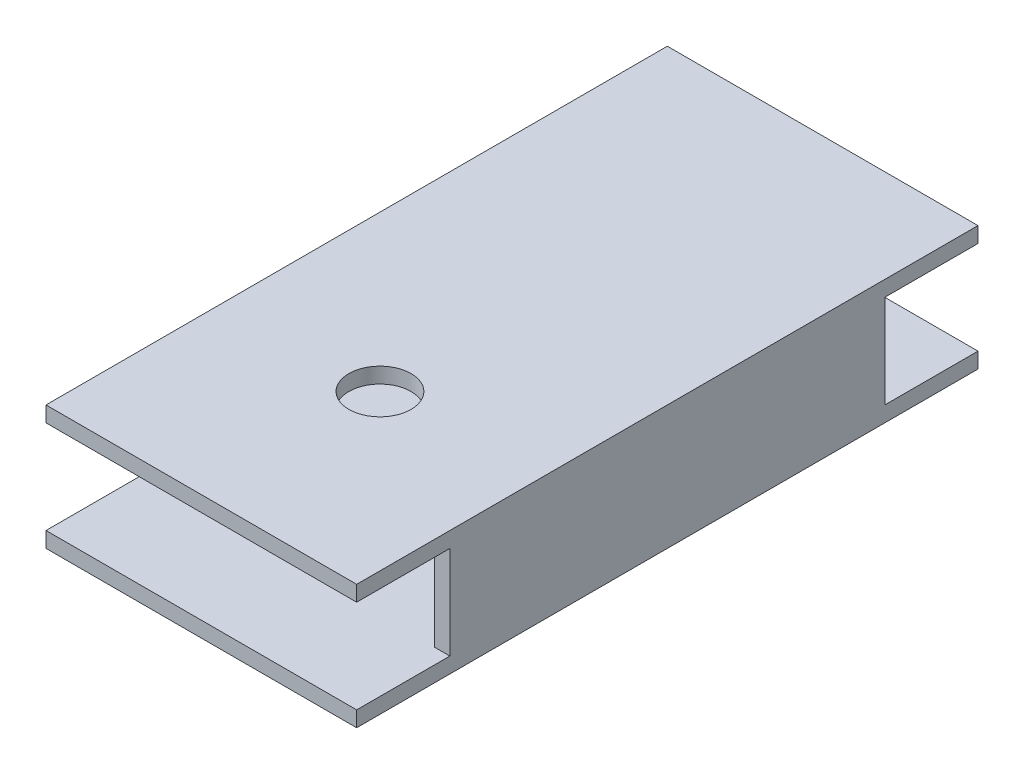
ISO-10303-21;
HEADER;
FILE_DESCRIPTION(('STEP AP214'),'2;1');
FILE_NAME('part.step','',(''),(''),'','','');
FILE_SCHEMA(('AUTOMOTIVE_DESIGN { 1 0 10303 214 1 1 1 1 }'));
ENDSEC;
DATA;
#1=APPLICATION_CONTEXT('core data for automotive mechanical design processes');
#2=APPLICATION_PROTOCOL_DEFINITION('international standard','automotive_design',2000,#1);
#3=PRODUCT_CONTEXT('',#1,'mechanical');
#4=PRODUCT('Part','Part','',(#3));
#5=PRODUCT_RELATED_PRODUCT_CATEGORY('part','',(#4));
#6=PRODUCT_DEFINITION_FORMATION('','',#4);
#7=PRODUCT_DEFINITION_CONTEXT('part definition',#1,'design');
#8=PRODUCT_DEFINITION('design','',#6,#7);
#9=PRODUCT_DEFINITION_SHAPE('','',#8);
#10=(LENGTH_UNIT() NAMED_UNIT(*) SI_UNIT(.MILLI.,.METRE.));
#11=(NAMED_UNIT(*) PLANE_ANGLE_UNIT() SI_UNIT($,.RADIAN.));
#12=(NAMED_UNIT(*) SI_UNIT($,.STERADIAN.) SOLID_ANGLE_UNIT());
#13=UNCERTAINTY_MEASURE_WITH_UNIT(LENGTH_MEASURE(1.E-05),#10,'distance_accuracy_value','');
#14=(GEOMETRIC_REPRESENTATION_CONTEXT(3) GLOBAL_UNCERTAINTY_ASSIGNED_CONTEXT((#13)) GLOBAL_UNIT_ASSIGNED_CONTEXT((#10,
#11,#12)) REPRESENTATION_CONTEXT('',''));
#15=CARTESIAN_POINT('',(0.,0.,0.));
#16=DIRECTION('',(0.,0.,1.));
#17=DIRECTION('',(1.,0.,0.));
#18=AXIS2_PLACEMENT_3D('',#15,#16,#17);
#19=CARTESIAN_POINT('',(0.,0.,127.));
#20=DIRECTION('',(0.,0.,1.));
#21=DIRECTION('',(1.,0.,0.));
#22=AXIS2_PLACEMENT_3D('',#19,#20,#21);
#23=PLANE('',#22);
#24=DIRECTION('',(-1.,0.,0.));
#25=VECTOR('',#24,1.);
#26=CARTESIAN_POINT('',(0.,22.225,127.));
#27=LINE('',#26,#25);
#28=CARTESIAN_POINT('',(63.5,22.225,127.));
#29=VERTEX_POINT('',#28);
#30=CARTESIAN_POINT('',(0.,22.225,127.));
#31=VERTEX_POINT('',#30);
#32=EDGE_CURVE('E181',#29,#31,#27,.T.);
#33=ORIENTED_EDGE('',*,*,#32,.F.);
#34=DIRECTION('',(0.,1.,0.));
#35=VECTOR('',#34,1.);
#36=CARTESIAN_POINT('',(63.5,0.,127.));
#37=LINE('',#36,#35);
#38=CARTESIAN_POINT('',(63.5,25.4,127.));
#39=VERTEX_POINT('',#38);
#40=EDGE_CURVE('E208',#29,#39,#37,.T.);
#41=ORIENTED_EDGE('',*,*,#40,.T.);
#42=DIRECTION('',(-1.,0.,0.));
#43=VECTOR('',#42,1.);
#44=CARTESIAN_POINT('',(0.,25.4,127.));
#45=LINE('',#44,#43);
#46=CARTESIAN_POINT('',(0.,25.4,127.));
#47=VERTEX_POINT('',#46);
#48=EDGE_CURVE('E210',#39,#47,#45,.T.);
#49=ORIENTED_EDGE('',*,*,#48,.T.);
#50=DIRECTION('',(0.,-1.,0.));
#51=VECTOR('',#50,1.);
#52=CARTESIAN_POINT('',(0.,0.,127.));
#53=LINE('',#52,#51);
#54=EDGE_CURVE('E196',#47,#31,#53,.T.);
#55=ORIENTED_EDGE('',*,*,#54,.T.);
#56=EDGE_LOOP('',(#33,#41,#49,#55));
#57=FACE_BOUND('',#56,.T.);
#58=ADVANCED_FACE('F57',(#57),#23,.T.);
#59=CARTESIAN_POINT('',(0.,0.,0.));
#60=DIRECTION('',(0.,0.,1.));
#61=DIRECTION('',(1.,0.,0.));
#62=AXIS2_PLACEMENT_3D('',#59,#60,#61);
#63=PLANE('',#62);
#64=DIRECTION('',(0.,-1.,0.));
#65=VECTOR('',#64,1.);
#66=CARTESIAN_POINT('',(0.,0.,0.));
#67=LINE('',#66,#65);
#68=CARTESIAN_POINT('',(0.,3.175,0.));
#69=VERTEX_POINT('',#68);
#70=CARTESIAN_POINT('',(0.,0.,0.));
#71=VERTEX_POINT('',#70);
#72=EDGE_CURVE('E217',#69,#71,#67,.T.);
#73=ORIENTED_EDGE('',*,*,#72,.F.);
#74=DIRECTION('',(1.,0.,0.));
#75=VECTOR('',#74,1.);
#76=CARTESIAN_POINT('',(0.,3.175,0.));
#77=LINE('',#76,#75);
#78=CARTESIAN_POINT('',(63.5,3.175,0.));
#79=VERTEX_POINT('',#78);
#80=EDGE_CURVE('E239',#69,#79,#77,.T.);
#81=ORIENTED_EDGE('',*,*,#80,.T.);
#82=DIRECTION('',(0.,1.,0.));
#83=VECTOR('',#82,1.);
#84=CARTESIAN_POINT('',(63.5,0.,0.));
#85=LINE('',#84,#83);
#86=CARTESIAN_POINT('',(63.5,0.,0.));
#87=VERTEX_POINT('',#86);
#88=EDGE_CURVE('E201',#87,#79,#85,.T.);
#89=ORIENTED_EDGE('',*,*,#88,.F.);
#90=DIRECTION('',(1.,0.,0.));
#91=VECTOR('',#90,1.);
#92=CARTESIAN_POINT('',(0.,0.,0.));
#93=LINE('',#92,#91);
#94=EDGE_CURVE('E216',#71,#87,#93,.T.);
#95=ORIENTED_EDGE('',*,*,#94,.F.);
#96=EDGE_LOOP('',(#73,#81,#89,#95));
#97=FACE_BOUND('',#96,.T.);
#98=ADVANCED_FACE('F238',(#97),#63,.F.);
#99=DIRECTION('',(1.,0.,0.));
#100=VECTOR('',#99,1.);
#101=CARTESIAN_POINT('',(0.,3.175,127.));
#102=LINE('',#101,#100);
#103=CARTESIAN_POINT('',(0.,3.175,127.));
#104=VERTEX_POINT('',#103);
#105=CARTESIAN_POINT('',(63.5,3.175,127.));
#106=VERTEX_POINT('',#105);
#107=EDGE_CURVE('E172',#104,#106,#102,.T.);
#108=ORIENTED_EDGE('',*,*,#107,.F.);
#109=CARTESIAN_POINT('',(0.,0.,127.));
#110=VERTEX_POINT('',#109);
#111=EDGE_CURVE('E176',#104,#110,#53,.T.);
#112=ORIENTED_EDGE('',*,*,#111,.T.);
#113=DIRECTION('',(1.,0.,0.));
#114=VECTOR('',#113,1.);
#115=CARTESIAN_POINT('',(0.,0.,127.));
#116=LINE('',#115,#114);
#117=CARTESIAN_POINT('',(63.5,0.,127.));
#118=VERTEX_POINT('',#117);
#119=EDGE_CURVE('E200',#110,#118,#116,.T.);
#120=ORIENTED_EDGE('',*,*,#119,.T.);
#121=EDGE_CURVE('E179',#118,#106,#37,.T.);
#122=ORIENTED_EDGE('',*,*,#121,.T.);
#123=EDGE_LOOP('',(#108,#112,#120,#122));
#124=FACE_BOUND('',#123,.T.);
#125=ADVANCED_FACE('F174',(#124),#23,.T.);
#126=CARTESIAN_POINT('',(63.5,22.225,0.));
#127=VERTEX_POINT('',#126);
#128=CARTESIAN_POINT('',(63.5,25.4,0.));
#129=VERTEX_POINT('',#128);
#130=EDGE_CURVE('E219',#127,#129,#85,.T.);
#131=ORIENTED_EDGE('',*,*,#130,.F.);
#132=DIRECTION('',(-1.,0.,0.));
#133=VECTOR('',#132,1.);
#134=CARTESIAN_POINT('',(0.,22.225,0.));
#135=LINE('',#134,#133);
#136=CARTESIAN_POINT('',(0.,22.225,0.));
#137=VERTEX_POINT('',#136);
#138=EDGE_CURVE('E182',#127,#137,#135,.T.);
#139=ORIENTED_EDGE('',*,*,#138,.T.);
#140=CARTESIAN_POINT('',(0.,25.4,0.));
#141=VERTEX_POINT('',#140);
#142=EDGE_CURVE('E213',#141,#137,#67,.T.);
#143=ORIENTED_EDGE('',*,*,#142,.F.);
#144=DIRECTION('',(-1.,0.,0.));
#145=VECTOR('',#144,1.);
#146=CARTESIAN_POINT('',(0.,25.4,0.));
#147=LINE('',#146,#145);
#148=EDGE_CURVE('E197',#129,#141,#147,.T.);
#149=ORIENTED_EDGE('',*,*,#148,.F.);
#150=EDGE_LOOP('',(#131,#139,#143,#149));
#151=FACE_BOUND('',#150,.T.);
#152=ADVANCED_FACE('F349',(#151),#63,.F.);
#153=CARTESIAN_POINT('',(0.,0.,127.));
#154=DIRECTION('',(1.,0.,0.));
#155=DIRECTION('',(0.,0.,-1.));
#156=AXIS2_PLACEMENT_3D('',#153,#154,#155);
#157=PLANE('',#156);
#158=DIRECTION('',(0.,1.,0.));
#159=VECTOR('',#158,1.);
#160=CARTESIAN_POINT('',(0.,22.225,107.95));
#161=LINE('',#160,#159);
#162=CARTESIAN_POINT('',(0.,3.175,107.95));
#163=VERTEX_POINT('',#162);
#164=CARTESIAN_POINT('',(0.,22.225,107.95));
#165=VERTEX_POINT('',#164);
#166=EDGE_CURVE('E192',#163,#165,#161,.T.);
#167=ORIENTED_EDGE('',*,*,#166,.T.);
#168=DIRECTION('',(0.,0.,1.));
#169=VECTOR('',#168,1.);
#170=CARTESIAN_POINT('',(0.,22.225,127.));
#171=LINE('',#170,#169);
#172=EDGE_CURVE('E308',#165,#31,#171,.T.);
#173=ORIENTED_EDGE('',*,*,#172,.T.);
#174=ORIENTED_EDGE('',*,*,#54,.F.);
#175=DIRECTION('',(0.,0.,-1.));
#176=VECTOR('',#175,1.);
#177=CARTESIAN_POINT('',(0.,25.4,127.));
#178=LINE('',#177,#176);
#179=EDGE_CURVE('E212',#47,#141,#178,.T.);
#180=ORIENTED_EDGE('',*,*,#179,.T.);
#181=ORIENTED_EDGE('',*,*,#142,.T.);
#182=DIRECTION('',(0.,0.,1.));
#183=VECTOR('',#182,1.);
#184=CARTESIAN_POINT('',(0.,22.225,0.));
#185=LINE('',#184,#183);
#186=CARTESIAN_POINT('',(0.,22.225,19.05));
#187=VERTEX_POINT('',#186);
#188=EDGE_CURVE('E250',#137,#187,#185,.T.);
#189=ORIENTED_EDGE('',*,*,#188,.T.);
#190=DIRECTION('',(0.,-1.,0.));
#191=VECTOR('',#190,1.);
#192=CARTESIAN_POINT('',(0.,22.225,19.05));
#193=LINE('',#192,#191);
#194=CARTESIAN_POINT('',(0.,3.175,19.05));
#195=VERTEX_POINT('',#194);
#196=EDGE_CURVE('E254',#187,#195,#193,.T.);
#197=ORIENTED_EDGE('',*,*,#196,.T.);
#198=DIRECTION('',(0.,0.,-1.));
#199=VECTOR('',#198,1.);
#200=CARTESIAN_POINT('',(0.,3.175,0.));
#201=LINE('',#200,#199);
#202=EDGE_CURVE('E282',#195,#69,#201,.T.);
#203=ORIENTED_EDGE('',*,*,#202,.T.);
#204=ORIENTED_EDGE('',*,*,#72,.T.);
#205=DIRECTION('',(0.,0.,-1.));
#206=VECTOR('',#205,1.);
#207=CARTESIAN_POINT('',(0.,0.,127.));
#208=LINE('',#207,#206);
#209=EDGE_CURVE('E12',#110,#71,#208,.T.);
#210=ORIENTED_EDGE('',*,*,#209,.F.);
#211=ORIENTED_EDGE('',*,*,#111,.F.);
#212=DIRECTION('',(0.,0.,-1.));
#213=VECTOR('',#212,1.);
#214=CARTESIAN_POINT('',(0.,3.175,127.));
#215=LINE('',#214,#213);
#216=EDGE_CURVE('E185',#104,#163,#215,.T.);
#217=ORIENTED_EDGE('',*,*,#216,.T.);
#218=EDGE_LOOP('',(#167,#173,#174,#180,#181,#189,#197,#203,#204,#210,#211,#217));
#219=FACE_BOUND('',#218,.T.);
#220=ADVANCED_FACE('F59',(#219),#157,.F.);
#221=CARTESIAN_POINT('',(0.,0.,127.));
#222=DIRECTION('',(0.,1.,0.));
#223=DIRECTION('',(0.,0.,1.));
#224=AXIS2_PLACEMENT_3D('',#221,#222,#223);
#225=PLANE('',#224);
#226=CARTESIAN_POINT('',(31.75,0.,90.4875));
#227=DIRECTION('',(0.,1.,0.));
#228=DIRECTION('',(0.,0.,1.));
#229=AXIS2_PLACEMENT_3D('',#226,#227,#228);
#230=CIRCLE('',#229,6.35);
#231=CARTESIAN_POINT('',(31.75,0.,96.8375));
#232=VERTEX_POINT('',#231);
#233=EDGE_CURVE('E317',#232,#232,#230,.T.);
#234=ORIENTED_EDGE('',*,*,#233,.T.);
#235=EDGE_LOOP('',(#234));
#236=FACE_BOUND('',#235,.T.);
#237=ORIENTED_EDGE('',*,*,#94,.T.);
#238=DIRECTION('',(0.,0.,-1.));
#239=VECTOR('',#238,1.);
#240=CARTESIAN_POINT('',(63.5,0.,127.));
#241=LINE('',#240,#239);
#242=EDGE_CURVE('E66',#118,#87,#241,.T.);
#243=ORIENTED_EDGE('',*,*,#242,.F.);
#244=ORIENTED_EDGE('',*,*,#119,.F.);
#245=ORIENTED_EDGE('',*,*,#209,.T.);
#246=EDGE_LOOP('',(#237,#243,#244,#245));
#247=FACE_BOUND('',#246,.T.);
#248=ADVANCED_FACE('F380',(#236,#247),#225,.F.);
#249=CARTESIAN_POINT('',(63.5,0.,127.));
#250=DIRECTION('',(-1.,0.,0.));
#251=DIRECTION('',(0.,0.,1.));
#252=AXIS2_PLACEMENT_3D('',#249,#250,#251);
#253=PLANE('',#252);
#254=ORIENTED_EDGE('',*,*,#40,.F.);
#255=DIRECTION('',(0.,0.,1.));
#256=VECTOR('',#255,1.);
#257=CARTESIAN_POINT('',(63.5,22.225,127.));
#258=LINE('',#257,#256);
#259=CARTESIAN_POINT('',(63.5,22.225,107.95));
#260=VERTEX_POINT('',#259);
#261=EDGE_CURVE('E193',#260,#29,#258,.T.);
#262=ORIENTED_EDGE('',*,*,#261,.F.);
#263=DIRECTION('',(0.,1.,0.));
#264=VECTOR('',#263,1.);
#265=CARTESIAN_POINT('',(63.5,22.225,107.95));
#266=LINE('',#265,#264);
#267=CARTESIAN_POINT('',(63.5,3.175,107.95));
#268=VERTEX_POINT('',#267);
#269=EDGE_CURVE('E302',#268,#260,#266,.T.);
#270=ORIENTED_EDGE('',*,*,#269,.F.);
#271=DIRECTION('',(0.,0.,-1.));
#272=VECTOR('',#271,1.);
#273=CARTESIAN_POINT('',(63.5,3.175,127.));
#274=LINE('',#273,#272);
#275=EDGE_CURVE('E305',#106,#268,#274,.T.);
#276=ORIENTED_EDGE('',*,*,#275,.F.);
#277=ORIENTED_EDGE('',*,*,#121,.F.);
#278=ORIENTED_EDGE('',*,*,#242,.T.);
#279=ORIENTED_EDGE('',*,*,#88,.T.);
#280=DIRECTION('',(0.,0.,-1.));
#281=VECTOR('',#280,1.);
#282=CARTESIAN_POINT('',(63.5,3.175,0.));
#283=LINE('',#282,#281);
#284=CARTESIAN_POINT('',(63.5,3.175,19.05));
#285=VERTEX_POINT('',#284);
#286=EDGE_CURVE('E245',#285,#79,#283,.T.);
#287=ORIENTED_EDGE('',*,*,#286,.F.);
#288=DIRECTION('',(0.,-1.,0.));
#289=VECTOR('',#288,1.);
#290=CARTESIAN_POINT('',(63.5,22.225,19.05));
#291=LINE('',#290,#289);
#292=CARTESIAN_POINT('',(63.5,22.225,19.05));
#293=VERTEX_POINT('',#292);
#294=EDGE_CURVE('E251',#293,#285,#291,.T.);
#295=ORIENTED_EDGE('',*,*,#294,.F.);
#296=DIRECTION('',(0.,0.,1.));
#297=VECTOR('',#296,1.);
#298=CARTESIAN_POINT('',(63.5,22.225,0.));
#299=LINE('',#298,#297);
#300=EDGE_CURVE('E256',#127,#293,#299,.T.);
#301=ORIENTED_EDGE('',*,*,#300,.F.);
#302=ORIENTED_EDGE('',*,*,#130,.T.);
#303=DIRECTION('',(0.,0.,-1.));
#304=VECTOR('',#303,1.);
#305=CARTESIAN_POINT('',(63.5,25.4,127.));
#306=LINE('',#305,#304);
#307=EDGE_CURVE('E224',#39,#129,#306,.T.);
#308=ORIENTED_EDGE('',*,*,#307,.F.);
#309=EDGE_LOOP('',(#254,#262,#270,#276,#277,#278,#279,#287,#295,#301,#302,#308));
#310=FACE_BOUND('',#309,.T.);
#311=ADVANCED_FACE('F232',(#310),#253,.F.);
#312=CARTESIAN_POINT('',(0.,25.4,127.));
#313=DIRECTION('',(0.,-1.,0.));
#314=DIRECTION('',(0.,0.,-1.));
#315=AXIS2_PLACEMENT_3D('',#312,#313,#314);
#316=PLANE('',#315);
#317=CARTESIAN_POINT('',(31.75,25.4,90.4875));
#318=DIRECTION('',(0.,1.,0.));
#319=DIRECTION('',(0.,0.,1.));
#320=AXIS2_PLACEMENT_3D('',#317,#318,#319);
#321=CIRCLE('',#320,6.35);
#322=CARTESIAN_POINT('',(31.75,25.4,96.8375));
#323=VERTEX_POINT('',#322);
#324=EDGE_CURVE('E314',#323,#323,#321,.T.);
#325=ORIENTED_EDGE('',*,*,#324,.F.);
#326=EDGE_LOOP('',(#325));
#327=FACE_BOUND('',#326,.T.);
#328=ORIENTED_EDGE('',*,*,#148,.T.);
#329=ORIENTED_EDGE('',*,*,#179,.F.);
#330=ORIENTED_EDGE('',*,*,#48,.F.);
#331=ORIENTED_EDGE('',*,*,#307,.T.);
#332=EDGE_LOOP('',(#328,#329,#330,#331));
#333=FACE_BOUND('',#332,.T.);
#334=ADVANCED_FACE('F344',(#327,#333),#316,.F.);
#335=CARTESIAN_POINT('',(3.175,0.,127.));
#336=DIRECTION('',(1.,0.,0.));
#337=DIRECTION('',(0.,0.,-1.));
#338=AXIS2_PLACEMENT_3D('',#335,#336,#337);
#339=PLANE('',#338);
#340=DIRECTION('',(0.,1.,0.));
#341=VECTOR('',#340,1.);
#342=CARTESIAN_POINT('',(3.175,0.,107.95));
#343=LINE('',#342,#341);
#344=CARTESIAN_POINT('',(3.175,3.175,107.95));
#345=VERTEX_POINT('',#344);
#346=CARTESIAN_POINT('',(3.175,22.225,107.95));
#347=VERTEX_POINT('',#346);
#348=EDGE_CURVE('E287',#345,#347,#343,.T.);
#349=ORIENTED_EDGE('',*,*,#348,.F.);
#350=DIRECTION('',(0.,0.,-1.));
#351=VECTOR('',#350,1.);
#352=CARTESIAN_POINT('',(3.175,3.175,127.));
#353=LINE('',#352,#351);
#354=CARTESIAN_POINT('',(3.175,3.175,19.05));
#355=VERTEX_POINT('',#354);
#356=EDGE_CURVE('E205',#345,#355,#353,.T.);
#357=ORIENTED_EDGE('',*,*,#356,.T.);
#358=DIRECTION('',(0.,-1.,0.));
#359=VECTOR('',#358,1.);
#360=CARTESIAN_POINT('',(3.175,0.,19.05));
#361=LINE('',#360,#359);
#362=CARTESIAN_POINT('',(3.175,22.225,19.05));
#363=VERTEX_POINT('',#362);
#364=EDGE_CURVE('E243',#363,#355,#361,.T.);
#365=ORIENTED_EDGE('',*,*,#364,.F.);
#366=DIRECTION('',(0.,0.,-1.));
#367=VECTOR('',#366,1.);
#368=CARTESIAN_POINT('',(3.175,22.225,127.));
#369=LINE('',#368,#367);
#370=EDGE_CURVE('E272',#347,#363,#369,.T.);
#371=ORIENTED_EDGE('',*,*,#370,.F.);
#372=EDGE_LOOP('',(#349,#357,#365,#371));
#373=FACE_BOUND('',#372,.T.);
#374=ADVANCED_FACE('F354',(#373),#339,.T.);
#375=CARTESIAN_POINT('',(0.,3.175,127.));
#376=DIRECTION('',(0.,1.,0.));
#377=DIRECTION('',(0.,0.,1.));
#378=AXIS2_PLACEMENT_3D('',#375,#376,#377);
#379=PLANE('',#378);
#380=CARTESIAN_POINT('',(31.75,3.175,90.4875));
#381=DIRECTION('',(0.,1.,0.));
#382=DIRECTION('',(0.,0.,1.));
#383=AXIS2_PLACEMENT_3D('',#380,#381,#382);
#384=CIRCLE('',#383,6.35);
#385=CARTESIAN_POINT('',(31.75,3.175,96.8375));
#386=VERTEX_POINT('',#385);
#387=EDGE_CURVE('E307',#386,#386,#384,.T.);
#388=ORIENTED_EDGE('',*,*,#387,.F.);
#389=EDGE_LOOP('',(#388));
#390=FACE_BOUND('',#389,.T.);
#391=ORIENTED_EDGE('',*,*,#356,.F.);
#392=DIRECTION('',(1.,0.,0.));
#393=VECTOR('',#392,1.);
#394=CARTESIAN_POINT('',(0.,3.175,107.95));
#395=LINE('',#394,#393);
#396=EDGE_CURVE('E188',#163,#345,#395,.T.);
#397=ORIENTED_EDGE('',*,*,#396,.F.);
#398=ORIENTED_EDGE('',*,*,#216,.F.);
#399=ORIENTED_EDGE('',*,*,#107,.T.);
#400=ORIENTED_EDGE('',*,*,#275,.T.);
#401=CARTESIAN_POINT('',(60.325,3.175,107.95));
#402=VERTEX_POINT('',#401);
#403=EDGE_CURVE('E73',#402,#268,#395,.T.);
#404=ORIENTED_EDGE('',*,*,#403,.F.);
#405=DIRECTION('',(0.,0.,-1.));
#406=VECTOR('',#405,1.);
#407=CARTESIAN_POINT('',(60.325,3.175,127.));
#408=LINE('',#407,#406);
#409=CARTESIAN_POINT('',(60.325,3.175,19.05));
#410=VERTEX_POINT('',#409);
#411=EDGE_CURVE('E276',#402,#410,#408,.T.);
#412=ORIENTED_EDGE('',*,*,#411,.T.);
#413=DIRECTION('',(1.,0.,0.));
#414=VECTOR('',#413,1.);
#415=CARTESIAN_POINT('',(0.,3.175,19.05));
#416=LINE('',#415,#414);
#417=EDGE_CURVE('E247',#410,#285,#416,.T.);
#418=ORIENTED_EDGE('',*,*,#417,.T.);
#419=ORIENTED_EDGE('',*,*,#286,.T.);
#420=ORIENTED_EDGE('',*,*,#80,.F.);
#421=ORIENTED_EDGE('',*,*,#202,.F.);
#422=EDGE_CURVE('E260',#195,#355,#416,.T.);
#423=ORIENTED_EDGE('',*,*,#422,.T.);
#424=EDGE_LOOP('',(#391,#397,#398,#399,#400,#404,#412,#418,#419,#420,#421,#423));
#425=FACE_BOUND('',#424,.T.);
#426=ADVANCED_FACE('F187',(#390,#425),#379,.T.);
#427=CARTESIAN_POINT('',(60.325,0.,127.));
#428=DIRECTION('',(-1.,0.,0.));
#429=DIRECTION('',(0.,0.,1.));
#430=AXIS2_PLACEMENT_3D('',#427,#428,#429);
#431=PLANE('',#430);
#432=DIRECTION('',(0.,-1.,0.));
#433=VECTOR('',#432,1.);
#434=CARTESIAN_POINT('',(60.325,0.,107.95));
#435=LINE('',#434,#433);
#436=CARTESIAN_POINT('',(60.325,22.225,107.95));
#437=VERTEX_POINT('',#436);
#438=EDGE_CURVE('E290',#437,#402,#435,.T.);
#439=ORIENTED_EDGE('',*,*,#438,.F.);
#440=DIRECTION('',(0.,0.,-1.));
#441=VECTOR('',#440,1.);
#442=CARTESIAN_POINT('',(60.325,22.225,127.));
#443=LINE('',#442,#441);
#444=CARTESIAN_POINT('',(60.325,22.225,19.05));
#445=VERTEX_POINT('',#444);
#446=EDGE_CURVE('E81',#437,#445,#443,.T.);
#447=ORIENTED_EDGE('',*,*,#446,.T.);
#448=DIRECTION('',(0.,1.,0.));
#449=VECTOR('',#448,1.);
#450=CARTESIAN_POINT('',(60.325,0.,19.05));
#451=LINE('',#450,#449);
#452=EDGE_CURVE('E263',#410,#445,#451,.T.);
#453=ORIENTED_EDGE('',*,*,#452,.F.);
#454=ORIENTED_EDGE('',*,*,#411,.F.);
#455=EDGE_LOOP('',(#439,#447,#453,#454));
#456=FACE_BOUND('',#455,.T.);
#457=ADVANCED_FACE('F330',(#456),#431,.T.);
#458=CARTESIAN_POINT('',(0.,22.225,127.));
#459=DIRECTION('',(0.,-1.,0.));
#460=DIRECTION('',(0.,0.,-1.));
#461=AXIS2_PLACEMENT_3D('',#458,#459,#460);
#462=PLANE('',#461);
#463=CARTESIAN_POINT('',(31.75,22.225,90.4875));
#464=DIRECTION('',(0.,-1.,0.));
#465=DIRECTION('',(0.,0.,-1.));
#466=AXIS2_PLACEMENT_3D('',#463,#464,#465);
#467=CIRCLE('',#466,6.35);
#468=CARTESIAN_POINT('',(31.75,22.225,84.1375));
#469=VERTEX_POINT('',#468);
#470=EDGE_CURVE('E61',#469,#469,#467,.T.);
#471=ORIENTED_EDGE('',*,*,#470,.F.);
#472=EDGE_LOOP('',(#471));
#473=FACE_BOUND('',#472,.T.);
#474=ORIENTED_EDGE('',*,*,#446,.F.);
#475=DIRECTION('',(1.,0.,0.));
#476=VECTOR('',#475,1.);
#477=CARTESIAN_POINT('',(0.,22.225,107.95));
#478=LINE('',#477,#476);
#479=EDGE_CURVE('E298',#437,#260,#478,.T.);
#480=ORIENTED_EDGE('',*,*,#479,.T.);
#481=ORIENTED_EDGE('',*,*,#261,.T.);
#482=ORIENTED_EDGE('',*,*,#32,.T.);
#483=ORIENTED_EDGE('',*,*,#172,.F.);
#484=EDGE_CURVE('E294',#165,#347,#478,.T.);
#485=ORIENTED_EDGE('',*,*,#484,.T.);
#486=ORIENTED_EDGE('',*,*,#370,.T.);
#487=DIRECTION('',(1.,0.,0.));
#488=VECTOR('',#487,1.);
#489=CARTESIAN_POINT('',(0.,22.225,19.05));
#490=LINE('',#489,#488);
#491=EDGE_CURVE('E264',#187,#363,#490,.T.);
#492=ORIENTED_EDGE('',*,*,#491,.F.);
#493=ORIENTED_EDGE('',*,*,#188,.F.);
#494=ORIENTED_EDGE('',*,*,#138,.F.);
#495=ORIENTED_EDGE('',*,*,#300,.T.);
#496=EDGE_CURVE('E267',#445,#293,#490,.T.);
#497=ORIENTED_EDGE('',*,*,#496,.F.);
#498=EDGE_LOOP('',(#474,#480,#481,#482,#483,#485,#486,#492,#493,#494,#495,#497));
#499=FACE_BOUND('',#498,.T.);
#500=ADVANCED_FACE('F327',(#473,#499),#462,.T.);
#501=CARTESIAN_POINT('',(0.,22.225,19.05));
#502=DIRECTION('',(0.,0.,1.));
#503=DIRECTION('',(1.,0.,0.));
#504=AXIS2_PLACEMENT_3D('',#501,#502,#503);
#505=PLANE('',#504);
#506=ORIENTED_EDGE('',*,*,#452,.T.);
#507=ORIENTED_EDGE('',*,*,#496,.T.);
#508=ORIENTED_EDGE('',*,*,#294,.T.);
#509=ORIENTED_EDGE('',*,*,#417,.F.);
#510=EDGE_LOOP('',(#506,#507,#508,#509));
#511=FACE_BOUND('',#510,.T.);
#512=ADVANCED_FACE('F329',(#511),#505,.F.);
#513=ORIENTED_EDGE('',*,*,#364,.T.);
#514=ORIENTED_EDGE('',*,*,#422,.F.);
#515=ORIENTED_EDGE('',*,*,#196,.F.);
#516=ORIENTED_EDGE('',*,*,#491,.T.);
#517=EDGE_LOOP('',(#513,#514,#515,#516));
#518=FACE_BOUND('',#517,.T.);
#519=ADVANCED_FACE('F353',(#518),#505,.F.);
#520=CARTESIAN_POINT('',(0.,22.225,107.95));
#521=DIRECTION('',(0.,0.,-1.));
#522=DIRECTION('',(-1.,0.,0.));
#523=AXIS2_PLACEMENT_3D('',#520,#521,#522);
#524=PLANE('',#523);
#525=ORIENTED_EDGE('',*,*,#438,.T.);
#526=ORIENTED_EDGE('',*,*,#403,.T.);
#527=ORIENTED_EDGE('',*,*,#269,.T.);
#528=ORIENTED_EDGE('',*,*,#479,.F.);
#529=EDGE_LOOP('',(#525,#526,#527,#528));
#530=FACE_BOUND('',#529,.T.);
#531=ADVANCED_FACE('F334',(#530),#524,.F.);
#532=ORIENTED_EDGE('',*,*,#348,.T.);
#533=ORIENTED_EDGE('',*,*,#484,.F.);
#534=ORIENTED_EDGE('',*,*,#166,.F.);
#535=ORIENTED_EDGE('',*,*,#396,.T.);
#536=EDGE_LOOP('',(#532,#533,#534,#535));
#537=FACE_BOUND('',#536,.T.);
#538=ADVANCED_FACE('F389',(#537),#524,.F.);
#539=CARTESIAN_POINT('',(31.75,0.,90.4875));
#540=DIRECTION('',(0.,1.,0.));
#541=DIRECTION('',(0.,0.,1.));
#542=AXIS2_PLACEMENT_3D('',#539,#540,#541);
#543=CYLINDRICAL_SURFACE('',#542,6.35);
#544=ORIENTED_EDGE('',*,*,#470,.T.);
#545=EDGE_LOOP('',(#544));
#546=FACE_BOUND('',#545,.T.);
#547=ORIENTED_EDGE('',*,*,#324,.T.);
#548=EDGE_LOOP('',(#547));
#549=FACE_BOUND('',#548,.T.);
#550=ADVANCED_FACE('F324',(#546,#549),#543,.F.);
#551=ORIENTED_EDGE('',*,*,#387,.T.);
#552=EDGE_LOOP('',(#551));
#553=FACE_BOUND('',#552,.T.);
#554=ORIENTED_EDGE('',*,*,#233,.F.);
#555=EDGE_LOOP('',(#554));
#556=FACE_BOUND('',#555,.T.);
#557=ADVANCED_FACE('F411',(#553,#556),#543,.F.);
#558=CLOSED_SHELL('',(#58,#98,#125,#152,#220,#248,#311,#334,#374,#426,#457,#500,#512,#519,#531,
#538,#550,#557));
#559=MANIFOLD_SOLID_BREP('B2',#558);
#560=ADVANCED_BREP_SHAPE_REPRESENTATION('',(#18,#559),#14);
#561=SHAPE_DEFINITION_REPRESENTATION(#9,#560);
ENDSEC;
END-ISO-10303-21;
